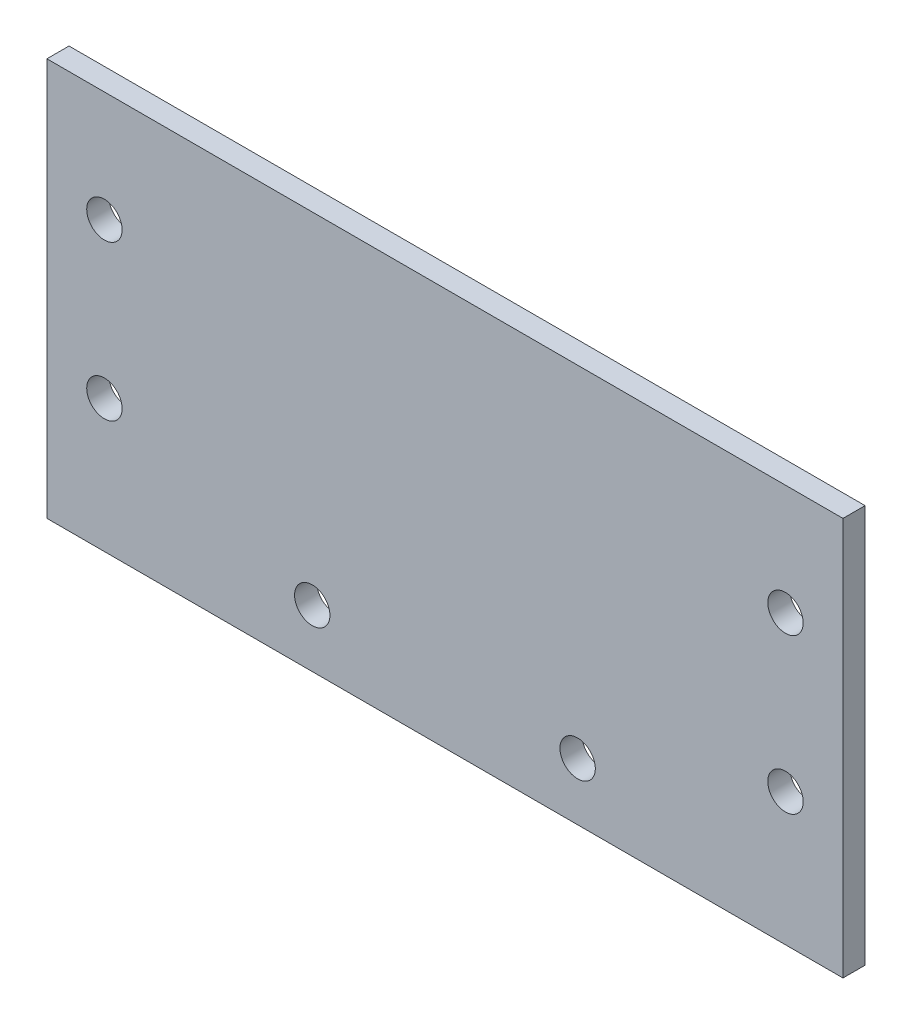
ISO-10303-21;
HEADER;
FILE_DESCRIPTION(('STEP AP214'),'2;1');
FILE_NAME('part.step','',(''),(''),'','','');
FILE_SCHEMA(('AUTOMOTIVE_DESIGN { 1 0 10303 214 1 1 1 1 }'));
ENDSEC;
DATA;
#1=APPLICATION_CONTEXT('core data for automotive mechanical design processes');
#2=APPLICATION_PROTOCOL_DEFINITION('international standard','automotive_design',2000,#1);
#3=PRODUCT_CONTEXT('',#1,'mechanical');
#4=PRODUCT('Part','Part','',(#3));
#5=PRODUCT_RELATED_PRODUCT_CATEGORY('part','',(#4));
#6=PRODUCT_DEFINITION_FORMATION('','',#4);
#7=PRODUCT_DEFINITION_CONTEXT('part definition',#1,'design');
#8=PRODUCT_DEFINITION('design','',#6,#7);
#9=PRODUCT_DEFINITION_SHAPE('','',#8);
#10=(LENGTH_UNIT() NAMED_UNIT(*) SI_UNIT(.MILLI.,.METRE.));
#11=(NAMED_UNIT(*) PLANE_ANGLE_UNIT() SI_UNIT($,.RADIAN.));
#12=(NAMED_UNIT(*) SI_UNIT($,.STERADIAN.) SOLID_ANGLE_UNIT());
#13=UNCERTAINTY_MEASURE_WITH_UNIT(LENGTH_MEASURE(1.E-05),#10,'distance_accuracy_value','');
#14=(GEOMETRIC_REPRESENTATION_CONTEXT(3) GLOBAL_UNCERTAINTY_ASSIGNED_CONTEXT((#13)) GLOBAL_UNIT_ASSIGNED_CONTEXT((#10,
#11,#12)) REPRESENTATION_CONTEXT('',''));
#15=CARTESIAN_POINT('',(0.,0.,0.));
#16=DIRECTION('',(0.,0.,1.));
#17=DIRECTION('',(1.,0.,0.));
#18=AXIS2_PLACEMENT_3D('',#15,#16,#17);
#19=CARTESIAN_POINT('',(0.,0.,5.));
#20=DIRECTION('',(1.,0.,0.));
#21=DIRECTION('',(0.,0.,-1.));
#22=AXIS2_PLACEMENT_3D('',#19,#20,#21);
#23=PLANE('',#22);
#24=DIRECTION('',(0.,-1.,0.));
#25=VECTOR('',#24,1.);
#26=CARTESIAN_POINT('',(0.,0.,0.));
#27=LINE('',#26,#25);
#28=CARTESIAN_POINT('',(0.,90.,0.));
#29=VERTEX_POINT('',#28);
#30=CARTESIAN_POINT('',(0.,0.,0.));
#31=VERTEX_POINT('',#30);
#32=EDGE_CURVE('E113',#29,#31,#27,.T.);
#33=ORIENTED_EDGE('',*,*,#32,.T.);
#34=DIRECTION('',(0.,0.,-1.));
#35=VECTOR('',#34,1.);
#36=CARTESIAN_POINT('',(0.,0.,5.));
#37=LINE('',#36,#35);
#38=CARTESIAN_POINT('',(0.,0.,5.));
#39=VERTEX_POINT('',#38);
#40=EDGE_CURVE('E11',#39,#31,#37,.T.);
#41=ORIENTED_EDGE('',*,*,#40,.F.);
#42=DIRECTION('',(0.,-1.,0.));
#43=VECTOR('',#42,1.);
#44=CARTESIAN_POINT('',(0.,0.,5.));
#45=LINE('',#44,#43);
#46=CARTESIAN_POINT('',(0.,90.,5.));
#47=VERTEX_POINT('',#46);
#48=EDGE_CURVE('E97',#47,#39,#45,.T.);
#49=ORIENTED_EDGE('',*,*,#48,.F.);
#50=DIRECTION('',(0.,0.,-1.));
#51=VECTOR('',#50,1.);
#52=CARTESIAN_POINT('',(0.,90.,5.));
#53=LINE('',#52,#51);
#54=EDGE_CURVE('E109',#47,#29,#53,.T.);
#55=ORIENTED_EDGE('',*,*,#54,.T.);
#56=EDGE_LOOP('',(#33,#41,#49,#55));
#57=FACE_BOUND('',#56,.T.);
#58=ADVANCED_FACE('F45',(#57),#23,.F.);
#59=CARTESIAN_POINT('',(0.,0.,5.));
#60=DIRECTION('',(0.,1.,0.));
#61=DIRECTION('',(0.,0.,1.));
#62=AXIS2_PLACEMENT_3D('',#59,#60,#61);
#63=PLANE('',#62);
#64=DIRECTION('',(1.,0.,0.));
#65=VECTOR('',#64,1.);
#66=CARTESIAN_POINT('',(0.,0.,0.));
#67=LINE('',#66,#65);
#68=CARTESIAN_POINT('',(180.,0.,0.));
#69=VERTEX_POINT('',#68);
#70=EDGE_CURVE('E102',#31,#69,#67,.T.);
#71=ORIENTED_EDGE('',*,*,#70,.T.);
#72=DIRECTION('',(0.,0.,-1.));
#73=VECTOR('',#72,1.);
#74=CARTESIAN_POINT('',(180.,0.,5.));
#75=LINE('',#74,#73);
#76=CARTESIAN_POINT('',(180.,0.,5.));
#77=VERTEX_POINT('',#76);
#78=EDGE_CURVE('E54',#77,#69,#75,.T.);
#79=ORIENTED_EDGE('',*,*,#78,.F.);
#80=DIRECTION('',(1.,0.,0.));
#81=VECTOR('',#80,1.);
#82=CARTESIAN_POINT('',(0.,0.,5.));
#83=LINE('',#82,#81);
#84=EDGE_CURVE('E92',#39,#77,#83,.T.);
#85=ORIENTED_EDGE('',*,*,#84,.F.);
#86=ORIENTED_EDGE('',*,*,#40,.T.);
#87=EDGE_LOOP('',(#71,#79,#85,#86));
#88=FACE_BOUND('',#87,.T.);
#89=ADVANCED_FACE('F101',(#88),#63,.F.);
#90=CARTESIAN_POINT('',(180.,0.,5.));
#91=DIRECTION('',(-1.,0.,0.));
#92=DIRECTION('',(0.,0.,1.));
#93=AXIS2_PLACEMENT_3D('',#90,#91,#92);
#94=PLANE('',#93);
#95=DIRECTION('',(0.,1.,0.));
#96=VECTOR('',#95,1.);
#97=CARTESIAN_POINT('',(180.,0.,0.));
#98=LINE('',#97,#96);
#99=CARTESIAN_POINT('',(180.,90.,0.));
#100=VERTEX_POINT('',#99);
#101=EDGE_CURVE('E79',#69,#100,#98,.T.);
#102=ORIENTED_EDGE('',*,*,#101,.T.);
#103=DIRECTION('',(0.,0.,-1.));
#104=VECTOR('',#103,1.);
#105=CARTESIAN_POINT('',(180.,90.,5.));
#106=LINE('',#105,#104);
#107=CARTESIAN_POINT('',(180.,90.,5.));
#108=VERTEX_POINT('',#107);
#109=EDGE_CURVE('E104',#108,#100,#106,.T.);
#110=ORIENTED_EDGE('',*,*,#109,.F.);
#111=DIRECTION('',(0.,1.,0.));
#112=VECTOR('',#111,1.);
#113=CARTESIAN_POINT('',(180.,0.,5.));
#114=LINE('',#113,#112);
#115=EDGE_CURVE('E95',#77,#108,#114,.T.);
#116=ORIENTED_EDGE('',*,*,#115,.F.);
#117=ORIENTED_EDGE('',*,*,#78,.T.);
#118=EDGE_LOOP('',(#102,#110,#116,#117));
#119=FACE_BOUND('',#118,.T.);
#120=ADVANCED_FACE('F105',(#119),#94,.F.);
#121=CARTESIAN_POINT('',(0.,90.,5.));
#122=DIRECTION('',(0.,-1.,0.));
#123=DIRECTION('',(0.,0.,-1.));
#124=AXIS2_PLACEMENT_3D('',#121,#122,#123);
#125=PLANE('',#124);
#126=DIRECTION('',(-1.,0.,0.));
#127=VECTOR('',#126,1.);
#128=CARTESIAN_POINT('',(0.,90.,0.));
#129=LINE('',#128,#127);
#130=EDGE_CURVE('E85',#100,#29,#129,.T.);
#131=ORIENTED_EDGE('',*,*,#130,.T.);
#132=ORIENTED_EDGE('',*,*,#54,.F.);
#133=DIRECTION('',(-1.,0.,0.));
#134=VECTOR('',#133,1.);
#135=CARTESIAN_POINT('',(0.,90.,5.));
#136=LINE('',#135,#134);
#137=EDGE_CURVE('E62',#108,#47,#136,.T.);
#138=ORIENTED_EDGE('',*,*,#137,.F.);
#139=ORIENTED_EDGE('',*,*,#109,.T.);
#140=EDGE_LOOP('',(#131,#132,#138,#139));
#141=FACE_BOUND('',#140,.T.);
#142=ADVANCED_FACE('F127',(#141),#125,.F.);
#143=CARTESIAN_POINT('',(0.,0.,5.));
#144=DIRECTION('',(0.,0.,-1.));
#145=DIRECTION('',(-1.,0.,0.));
#146=AXIS2_PLACEMENT_3D('',#143,#144,#145);
#147=PLANE('',#146);
#148=CARTESIAN_POINT('',(167.,65.,5.));
#149=DIRECTION('',(0.,0.,-1.));
#150=DIRECTION('',(-1.,0.,0.));
#151=AXIS2_PLACEMENT_3D('',#148,#149,#150);
#152=CIRCLE('',#151,4.);
#153=CARTESIAN_POINT('',(163.,65.,5.));
#154=VERTEX_POINT('',#153);
#155=EDGE_CURVE('E173',#154,#154,#152,.T.);
#156=ORIENTED_EDGE('',*,*,#155,.T.);
#157=EDGE_LOOP('',(#156));
#158=FACE_BOUND('',#157,.T.);
#159=CARTESIAN_POINT('',(167.,30.,5.));
#160=DIRECTION('',(0.,0.,-1.));
#161=DIRECTION('',(-1.,0.,0.));
#162=AXIS2_PLACEMENT_3D('',#159,#160,#161);
#163=CIRCLE('',#162,4.);
#164=CARTESIAN_POINT('',(163.,30.,5.));
#165=VERTEX_POINT('',#164);
#166=EDGE_CURVE('E165',#165,#165,#163,.T.);
#167=ORIENTED_EDGE('',*,*,#166,.T.);
#168=EDGE_LOOP('',(#167));
#169=FACE_BOUND('',#168,.T.);
#170=CARTESIAN_POINT('',(120.,13.,5.));
#171=DIRECTION('',(0.,0.,-1.));
#172=DIRECTION('',(-1.,0.,0.));
#173=AXIS2_PLACEMENT_3D('',#170,#171,#172);
#174=CIRCLE('',#173,4.);
#175=CARTESIAN_POINT('',(116.,13.,5.));
#176=VERTEX_POINT('',#175);
#177=EDGE_CURVE('E157',#176,#176,#174,.T.);
#178=ORIENTED_EDGE('',*,*,#177,.T.);
#179=EDGE_LOOP('',(#178));
#180=FACE_BOUND('',#179,.T.);
#181=CARTESIAN_POINT('',(60.,13.,5.));
#182=DIRECTION('',(0.,0.,-1.));
#183=DIRECTION('',(-1.,0.,0.));
#184=AXIS2_PLACEMENT_3D('',#181,#182,#183);
#185=CIRCLE('',#184,4.);
#186=CARTESIAN_POINT('',(56.,13.,5.));
#187=VERTEX_POINT('',#186);
#188=EDGE_CURVE('E149',#187,#187,#185,.T.);
#189=ORIENTED_EDGE('',*,*,#188,.T.);
#190=EDGE_LOOP('',(#189));
#191=FACE_BOUND('',#190,.T.);
#192=CARTESIAN_POINT('',(13.,30.,5.));
#193=DIRECTION('',(0.,0.,-1.));
#194=DIRECTION('',(-1.,0.,0.));
#195=AXIS2_PLACEMENT_3D('',#192,#193,#194);
#196=CIRCLE('',#195,4.);
#197=CARTESIAN_POINT('',(9.,30.,5.));
#198=VERTEX_POINT('',#197);
#199=EDGE_CURVE('E141',#198,#198,#196,.T.);
#200=ORIENTED_EDGE('',*,*,#199,.T.);
#201=EDGE_LOOP('',(#200));
#202=FACE_BOUND('',#201,.T.);
#203=CARTESIAN_POINT('',(13.,65.,5.));
#204=DIRECTION('',(0.,0.,-1.));
#205=DIRECTION('',(-1.,0.,0.));
#206=AXIS2_PLACEMENT_3D('',#203,#204,#205);
#207=CIRCLE('',#206,4.);
#208=CARTESIAN_POINT('',(9.,65.,5.));
#209=VERTEX_POINT('',#208);
#210=EDGE_CURVE('E117',#209,#209,#207,.T.);
#211=ORIENTED_EDGE('',*,*,#210,.T.);
#212=EDGE_LOOP('',(#211));
#213=FACE_BOUND('',#212,.T.);
#214=ORIENTED_EDGE('',*,*,#48,.T.);
#215=ORIENTED_EDGE('',*,*,#84,.T.);
#216=ORIENTED_EDGE('',*,*,#115,.T.);
#217=ORIENTED_EDGE('',*,*,#137,.T.);
#218=EDGE_LOOP('',(#214,#215,#216,#217));
#219=FACE_BOUND('',#218,.T.);
#220=ADVANCED_FACE('F93',(#158,#169,#180,#191,#202,#213,#219),#147,.F.);
#221=CARTESIAN_POINT('',(0.,0.,0.));
#222=DIRECTION('',(0.,0.,-1.));
#223=DIRECTION('',(-1.,0.,0.));
#224=AXIS2_PLACEMENT_3D('',#221,#222,#223);
#225=PLANE('',#224);
#226=CARTESIAN_POINT('',(167.,65.,0.));
#227=DIRECTION('',(0.,0.,-1.));
#228=DIRECTION('',(-1.,0.,0.));
#229=AXIS2_PLACEMENT_3D('',#226,#227,#228);
#230=CIRCLE('',#229,4.);
#231=CARTESIAN_POINT('',(163.,65.,0.));
#232=VERTEX_POINT('',#231);
#233=EDGE_CURVE('E177',#232,#232,#230,.T.);
#234=ORIENTED_EDGE('',*,*,#233,.F.);
#235=EDGE_LOOP('',(#234));
#236=FACE_BOUND('',#235,.T.);
#237=CARTESIAN_POINT('',(167.,30.,0.));
#238=DIRECTION('',(0.,0.,-1.));
#239=DIRECTION('',(-1.,0.,0.));
#240=AXIS2_PLACEMENT_3D('',#237,#238,#239);
#241=CIRCLE('',#240,4.);
#242=CARTESIAN_POINT('',(163.,30.,0.));
#243=VERTEX_POINT('',#242);
#244=EDGE_CURVE('E169',#243,#243,#241,.T.);
#245=ORIENTED_EDGE('',*,*,#244,.F.);
#246=EDGE_LOOP('',(#245));
#247=FACE_BOUND('',#246,.T.);
#248=CARTESIAN_POINT('',(120.,13.,0.));
#249=DIRECTION('',(0.,0.,-1.));
#250=DIRECTION('',(-1.,0.,0.));
#251=AXIS2_PLACEMENT_3D('',#248,#249,#250);
#252=CIRCLE('',#251,4.);
#253=CARTESIAN_POINT('',(116.,13.,0.));
#254=VERTEX_POINT('',#253);
#255=EDGE_CURVE('E161',#254,#254,#252,.T.);
#256=ORIENTED_EDGE('',*,*,#255,.F.);
#257=EDGE_LOOP('',(#256));
#258=FACE_BOUND('',#257,.T.);
#259=CARTESIAN_POINT('',(60.,13.,0.));
#260=DIRECTION('',(0.,0.,-1.));
#261=DIRECTION('',(-1.,0.,0.));
#262=AXIS2_PLACEMENT_3D('',#259,#260,#261);
#263=CIRCLE('',#262,4.);
#264=CARTESIAN_POINT('',(56.,13.,0.));
#265=VERTEX_POINT('',#264);
#266=EDGE_CURVE('E153',#265,#265,#263,.T.);
#267=ORIENTED_EDGE('',*,*,#266,.F.);
#268=EDGE_LOOP('',(#267));
#269=FACE_BOUND('',#268,.T.);
#270=CARTESIAN_POINT('',(13.,30.,0.));
#271=DIRECTION('',(0.,0.,-1.));
#272=DIRECTION('',(-1.,0.,0.));
#273=AXIS2_PLACEMENT_3D('',#270,#271,#272);
#274=CIRCLE('',#273,4.);
#275=CARTESIAN_POINT('',(9.,30.,0.));
#276=VERTEX_POINT('',#275);
#277=EDGE_CURVE('E145',#276,#276,#274,.T.);
#278=ORIENTED_EDGE('',*,*,#277,.F.);
#279=EDGE_LOOP('',(#278));
#280=FACE_BOUND('',#279,.T.);
#281=CARTESIAN_POINT('',(13.,65.,0.));
#282=DIRECTION('',(0.,0.,-1.));
#283=DIRECTION('',(-1.,0.,0.));
#284=AXIS2_PLACEMENT_3D('',#281,#282,#283);
#285=CIRCLE('',#284,4.);
#286=CARTESIAN_POINT('',(9.,65.,0.));
#287=VERTEX_POINT('',#286);
#288=EDGE_CURVE('E137',#287,#287,#285,.T.);
#289=ORIENTED_EDGE('',*,*,#288,.F.);
#290=EDGE_LOOP('',(#289));
#291=FACE_BOUND('',#290,.T.);
#292=ORIENTED_EDGE('',*,*,#32,.F.);
#293=ORIENTED_EDGE('',*,*,#130,.F.);
#294=ORIENTED_EDGE('',*,*,#101,.F.);
#295=ORIENTED_EDGE('',*,*,#70,.F.);
#296=EDGE_LOOP('',(#292,#293,#294,#295));
#297=FACE_BOUND('',#296,.T.);
#298=ADVANCED_FACE('F130',(#236,#247,#258,#269,#280,#291,#297),#225,.T.);
#299=CARTESIAN_POINT('',(13.,65.,0.));
#300=DIRECTION('',(0.,0.,-1.));
#301=DIRECTION('',(-1.,0.,0.));
#302=AXIS2_PLACEMENT_3D('',#299,#300,#301);
#303=CYLINDRICAL_SURFACE('',#302,4.);
#304=ORIENTED_EDGE('',*,*,#210,.F.);
#305=EDGE_LOOP('',(#304));
#306=FACE_BOUND('',#305,.T.);
#307=ORIENTED_EDGE('',*,*,#288,.T.);
#308=EDGE_LOOP('',(#307));
#309=FACE_BOUND('',#308,.T.);
#310=ADVANCED_FACE('F186',(#306,#309),#303,.F.);
#311=CARTESIAN_POINT('',(13.,30.,0.));
#312=DIRECTION('',(0.,0.,-1.));
#313=DIRECTION('',(-1.,0.,0.));
#314=AXIS2_PLACEMENT_3D('',#311,#312,#313);
#315=CYLINDRICAL_SURFACE('',#314,4.);
#316=ORIENTED_EDGE('',*,*,#199,.F.);
#317=EDGE_LOOP('',(#316));
#318=FACE_BOUND('',#317,.T.);
#319=ORIENTED_EDGE('',*,*,#277,.T.);
#320=EDGE_LOOP('',(#319));
#321=FACE_BOUND('',#320,.T.);
#322=ADVANCED_FACE('F199',(#318,#321),#315,.F.);
#323=CARTESIAN_POINT('',(60.,13.,0.));
#324=DIRECTION('',(0.,0.,-1.));
#325=DIRECTION('',(-1.,0.,0.));
#326=AXIS2_PLACEMENT_3D('',#323,#324,#325);
#327=CYLINDRICAL_SURFACE('',#326,4.);
#328=ORIENTED_EDGE('',*,*,#188,.F.);
#329=EDGE_LOOP('',(#328));
#330=FACE_BOUND('',#329,.T.);
#331=ORIENTED_EDGE('',*,*,#266,.T.);
#332=EDGE_LOOP('',(#331));
#333=FACE_BOUND('',#332,.T.);
#334=ADVANCED_FACE('F205',(#330,#333),#327,.F.);
#335=CARTESIAN_POINT('',(120.,13.,0.));
#336=DIRECTION('',(0.,0.,-1.));
#337=DIRECTION('',(-1.,0.,0.));
#338=AXIS2_PLACEMENT_3D('',#335,#336,#337);
#339=CYLINDRICAL_SURFACE('',#338,4.);
#340=ORIENTED_EDGE('',*,*,#177,.F.);
#341=EDGE_LOOP('',(#340));
#342=FACE_BOUND('',#341,.T.);
#343=ORIENTED_EDGE('',*,*,#255,.T.);
#344=EDGE_LOOP('',(#343));
#345=FACE_BOUND('',#344,.T.);
#346=ADVANCED_FACE('F238',(#342,#345),#339,.F.);
#347=CARTESIAN_POINT('',(167.,30.,0.));
#348=DIRECTION('',(0.,0.,-1.));
#349=DIRECTION('',(-1.,0.,0.));
#350=AXIS2_PLACEMENT_3D('',#347,#348,#349);
#351=CYLINDRICAL_SURFACE('',#350,4.);
#352=ORIENTED_EDGE('',*,*,#166,.F.);
#353=EDGE_LOOP('',(#352));
#354=FACE_BOUND('',#353,.T.);
#355=ORIENTED_EDGE('',*,*,#244,.T.);
#356=EDGE_LOOP('',(#355));
#357=FACE_BOUND('',#356,.T.);
#358=ADVANCED_FACE('F243',(#354,#357),#351,.F.);
#359=CARTESIAN_POINT('',(167.,65.,0.));
#360=DIRECTION('',(0.,0.,-1.));
#361=DIRECTION('',(-1.,0.,0.));
#362=AXIS2_PLACEMENT_3D('',#359,#360,#361);
#363=CYLINDRICAL_SURFACE('',#362,4.);
#364=ORIENTED_EDGE('',*,*,#155,.F.);
#365=EDGE_LOOP('',(#364));
#366=FACE_BOUND('',#365,.T.);
#367=ORIENTED_EDGE('',*,*,#233,.T.);
#368=EDGE_LOOP('',(#367));
#369=FACE_BOUND('',#368,.T.);
#370=ADVANCED_FACE('F182',(#366,#369),#363,.F.);
#371=CLOSED_SHELL('',(#58,#89,#120,#142,#220,#298,#310,#322,#334,#346,#358,#370));
#372=MANIFOLD_SOLID_BREP('B2',#371);
#373=ADVANCED_BREP_SHAPE_REPRESENTATION('',(#18,#372),#14);
#374=SHAPE_DEFINITION_REPRESENTATION(#9,#373);
ENDSEC;
END-ISO-10303-21;
